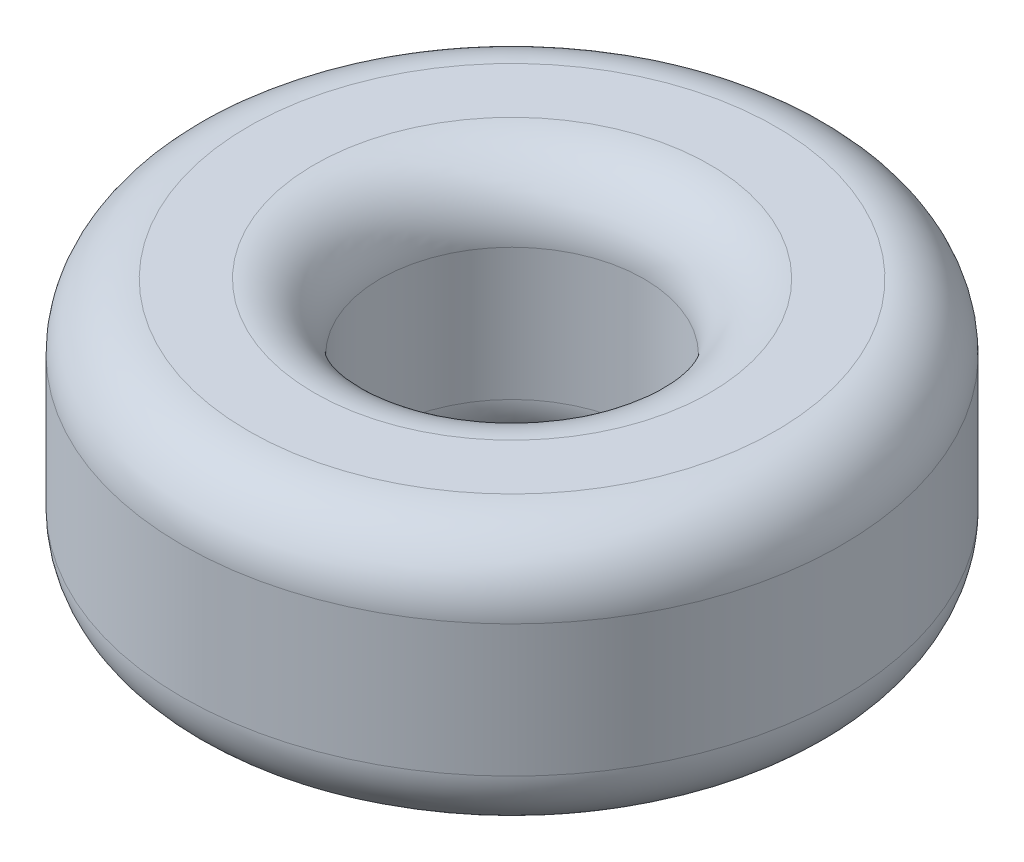
ISO-10303-21;
HEADER;
FILE_DESCRIPTION(('STEP AP214'),'2;1');
FILE_NAME('part.step','',(''),(''),'','','');
FILE_SCHEMA(('AUTOMOTIVE_DESIGN { 1 0 10303 214 1 1 1 1 }'));
ENDSEC;
DATA;
#1=APPLICATION_CONTEXT('core data for automotive mechanical design processes');
#2=APPLICATION_PROTOCOL_DEFINITION('international standard','automotive_design',2000,#1);
#3=PRODUCT_CONTEXT('',#1,'mechanical');
#4=PRODUCT('Part','Part','',(#3));
#5=PRODUCT_RELATED_PRODUCT_CATEGORY('part','',(#4));
#6=PRODUCT_DEFINITION_FORMATION('','',#4);
#7=PRODUCT_DEFINITION_CONTEXT('part definition',#1,'design');
#8=PRODUCT_DEFINITION('design','',#6,#7);
#9=PRODUCT_DEFINITION_SHAPE('','',#8);
#10=(LENGTH_UNIT() NAMED_UNIT(*) SI_UNIT(.MILLI.,.METRE.));
#11=(NAMED_UNIT(*) PLANE_ANGLE_UNIT() SI_UNIT($,.RADIAN.));
#12=(NAMED_UNIT(*) SI_UNIT($,.STERADIAN.) SOLID_ANGLE_UNIT());
#13=UNCERTAINTY_MEASURE_WITH_UNIT(LENGTH_MEASURE(1.E-05),#10,'distance_accuracy_value','');
#14=(GEOMETRIC_REPRESENTATION_CONTEXT(3) GLOBAL_UNCERTAINTY_ASSIGNED_CONTEXT((#13)) GLOBAL_UNIT_ASSIGNED_CONTEXT((#10,
#11,#12)) REPRESENTATION_CONTEXT('',''));
#15=CARTESIAN_POINT('',(0.,0.,0.));
#16=DIRECTION('',(0.,0.,1.));
#17=DIRECTION('',(1.,0.,0.));
#18=AXIS2_PLACEMENT_3D('',#15,#16,#17);
#19=CARTESIAN_POINT('',(0.,40.,0.));
#20=DIRECTION('',(0.,1.,0.));
#21=DIRECTION('',(0.,0.,1.));
#22=AXIS2_PLACEMENT_3D('',#19,#20,#21);
#23=PLANE('',#22);
#24=CARTESIAN_POINT('',(0.,40.,0.));
#25=DIRECTION('',(0.,1.,0.));
#26=DIRECTION('',(0.,0.,1.));
#27=AXIS2_PLACEMENT_3D('',#24,#25,#26);
#28=CIRCLE('',#27,30.);
#29=CARTESIAN_POINT('',(0.,40.,30.));
#30=VERTEX_POINT('',#29);
#31=EDGE_CURVE('E10',#30,#30,#28,.F.);
#32=ORIENTED_EDGE('',*,*,#31,.T.);
#33=EDGE_LOOP('',(#32));
#34=FACE_BOUND('',#33,.T.);
#35=CARTESIAN_POINT('',(0.,40.,0.));
#36=DIRECTION('',(0.,1.,0.));
#37=DIRECTION('',(0.,0.,1.));
#38=AXIS2_PLACEMENT_3D('',#35,#36,#37);
#39=CIRCLE('',#38,40.);
#40=CARTESIAN_POINT('',(0.,40.,40.));
#41=VERTEX_POINT('',#40);
#42=EDGE_CURVE('E51',#41,#41,#39,.T.);
#43=ORIENTED_EDGE('',*,*,#42,.T.);
#44=EDGE_LOOP('',(#43));
#45=FACE_BOUND('',#44,.T.);
#46=ADVANCED_FACE('F43',(#34,#45),#23,.T.);
#47=CARTESIAN_POINT('',(0.,0.,0.));
#48=DIRECTION('',(0.,1.,0.));
#49=DIRECTION('',(0.,0.,1.));
#50=AXIS2_PLACEMENT_3D('',#47,#48,#49);
#51=PLANE('',#50);
#52=CARTESIAN_POINT('',(0.,0.,0.));
#53=DIRECTION('',(0.,1.,0.));
#54=DIRECTION('',(0.,0.,1.));
#55=AXIS2_PLACEMENT_3D('',#52,#53,#54);
#56=CIRCLE('',#55,30.);
#57=CARTESIAN_POINT('',(0.,0.,30.));
#58=VERTEX_POINT('',#57);
#59=EDGE_CURVE('E75',#58,#58,#56,.T.);
#60=ORIENTED_EDGE('',*,*,#59,.T.);
#61=EDGE_LOOP('',(#60));
#62=FACE_BOUND('',#61,.T.);
#63=CARTESIAN_POINT('',(0.,0.,0.));
#64=DIRECTION('',(0.,1.,0.));
#65=DIRECTION('',(0.,0.,1.));
#66=AXIS2_PLACEMENT_3D('',#63,#64,#65);
#67=CIRCLE('',#66,40.);
#68=CARTESIAN_POINT('',(0.,0.,40.));
#69=VERTEX_POINT('',#68);
#70=EDGE_CURVE('E79',#69,#69,#67,.F.);
#71=ORIENTED_EDGE('',*,*,#70,.T.);
#72=EDGE_LOOP('',(#71));
#73=FACE_BOUND('',#72,.T.);
#74=ADVANCED_FACE('F84',(#62,#73),#51,.F.);
#75=CARTESIAN_POINT('',(0.,40.,0.));
#76=DIRECTION('',(0.,-1.,0.));
#77=DIRECTION('',(0.,0.,-1.));
#78=AXIS2_PLACEMENT_3D('',#75,#76,#77);
#79=CYLINDRICAL_SURFACE('',#78,50.);
#80=CARTESIAN_POINT('',(0.,10.,0.));
#81=DIRECTION('',(0.,1.,0.));
#82=DIRECTION('',(0.,0.,1.));
#83=AXIS2_PLACEMENT_3D('',#80,#81,#82);
#84=CIRCLE('',#83,50.);
#85=CARTESIAN_POINT('',(0.,10.,50.));
#86=VERTEX_POINT('',#85);
#87=EDGE_CURVE('E56',#86,#86,#84,.T.);
#88=ORIENTED_EDGE('',*,*,#87,.T.);
#89=EDGE_LOOP('',(#88));
#90=FACE_BOUND('',#89,.T.);
#91=CARTESIAN_POINT('',(0.,30.,0.));
#92=DIRECTION('',(0.,1.,0.));
#93=DIRECTION('',(0.,0.,1.));
#94=AXIS2_PLACEMENT_3D('',#91,#92,#93);
#95=CIRCLE('',#94,50.);
#96=CARTESIAN_POINT('',(0.,30.,50.));
#97=VERTEX_POINT('',#96);
#98=EDGE_CURVE('E61',#97,#97,#95,.F.);
#99=ORIENTED_EDGE('',*,*,#98,.T.);
#100=EDGE_LOOP('',(#99));
#101=FACE_BOUND('',#100,.T.);
#102=ADVANCED_FACE('F94',(#90,#101),#79,.T.);
#103=CARTESIAN_POINT('',(0.,40.,0.));
#104=DIRECTION('',(0.,-1.,0.));
#105=DIRECTION('',(0.,0.,-1.));
#106=AXIS2_PLACEMENT_3D('',#103,#104,#105);
#107=CYLINDRICAL_SURFACE('',#106,20.);
#108=CARTESIAN_POINT('',(0.,10.,0.));
#109=DIRECTION('',(0.,1.,0.));
#110=DIRECTION('',(0.,0.,1.));
#111=AXIS2_PLACEMENT_3D('',#108,#109,#110);
#112=CIRCLE('',#111,20.);
#113=CARTESIAN_POINT('',(0.,10.,20.));
#114=VERTEX_POINT('',#113);
#115=EDGE_CURVE('E67',#114,#114,#112,.F.);
#116=ORIENTED_EDGE('',*,*,#115,.T.);
#117=EDGE_LOOP('',(#116));
#118=FACE_BOUND('',#117,.T.);
#119=CARTESIAN_POINT('',(0.,30.,0.));
#120=DIRECTION('',(0.,1.,0.));
#121=DIRECTION('',(0.,0.,1.));
#122=AXIS2_PLACEMENT_3D('',#119,#120,#121);
#123=CIRCLE('',#122,20.);
#124=CARTESIAN_POINT('',(0.,30.,20.));
#125=VERTEX_POINT('',#124);
#126=EDGE_CURVE('E71',#125,#125,#123,.T.);
#127=ORIENTED_EDGE('',*,*,#126,.T.);
#128=EDGE_LOOP('',(#127));
#129=FACE_BOUND('',#128,.T.);
#130=ADVANCED_FACE('F97',(#118,#129),#107,.F.);
#131=CARTESIAN_POINT('',(0.,10.,0.));
#132=DIRECTION('',(0.,1.,0.));
#133=DIRECTION('',(0.,0.,1.));
#134=AXIS2_PLACEMENT_3D('',#131,#132,#133);
#135=TOROIDAL_SURFACE('',#134,30.,10.);
#136=ORIENTED_EDGE('',*,*,#115,.F.);
#137=EDGE_LOOP('',(#136));
#138=FACE_BOUND('',#137,.T.);
#139=ORIENTED_EDGE('',*,*,#59,.F.);
#140=EDGE_LOOP('',(#139));
#141=FACE_BOUND('',#140,.T.);
#142=ADVANCED_FACE('F90',(#138,#141),#135,.T.);
#143=CARTESIAN_POINT('',(0.,10.,0.));
#144=DIRECTION('',(0.,1.,0.));
#145=DIRECTION('',(0.,0.,1.));
#146=AXIS2_PLACEMENT_3D('',#143,#144,#145);
#147=TOROIDAL_SURFACE('',#146,40.,10.);
#148=ORIENTED_EDGE('',*,*,#70,.F.);
#149=EDGE_LOOP('',(#148));
#150=FACE_BOUND('',#149,.T.);
#151=ORIENTED_EDGE('',*,*,#87,.F.);
#152=EDGE_LOOP('',(#151));
#153=FACE_BOUND('',#152,.T.);
#154=ADVANCED_FACE('F86',(#150,#153),#147,.T.);
#155=CARTESIAN_POINT('',(0.,30.,0.));
#156=DIRECTION('',(0.,1.,0.));
#157=DIRECTION('',(0.,0.,1.));
#158=AXIS2_PLACEMENT_3D('',#155,#156,#157);
#159=TOROIDAL_SURFACE('',#158,30.,10.);
#160=ORIENTED_EDGE('',*,*,#31,.F.);
#161=EDGE_LOOP('',(#160));
#162=FACE_BOUND('',#161,.T.);
#163=ORIENTED_EDGE('',*,*,#126,.F.);
#164=EDGE_LOOP('',(#163));
#165=FACE_BOUND('',#164,.T.);
#166=ADVANCED_FACE('F89',(#162,#165),#159,.T.);
#167=CARTESIAN_POINT('',(0.,30.,0.));
#168=DIRECTION('',(0.,1.,0.));
#169=DIRECTION('',(0.,0.,1.));
#170=AXIS2_PLACEMENT_3D('',#167,#168,#169);
#171=TOROIDAL_SURFACE('',#170,40.,10.);
#172=ORIENTED_EDGE('',*,*,#98,.F.);
#173=EDGE_LOOP('',(#172));
#174=FACE_BOUND('',#173,.T.);
#175=ORIENTED_EDGE('',*,*,#42,.F.);
#176=EDGE_LOOP('',(#175));
#177=FACE_BOUND('',#176,.T.);
#178=ADVANCED_FACE('F45',(#174,#177),#171,.T.);
#179=CLOSED_SHELL('',(#46,#74,#102,#130,#142,#154,#166,#178));
#180=MANIFOLD_SOLID_BREP('B2',#179);
#181=ADVANCED_BREP_SHAPE_REPRESENTATION('',(#18,#180),#14);
#182=SHAPE_DEFINITION_REPRESENTATION(#9,#181);
ENDSEC;
END-ISO-10303-21;
